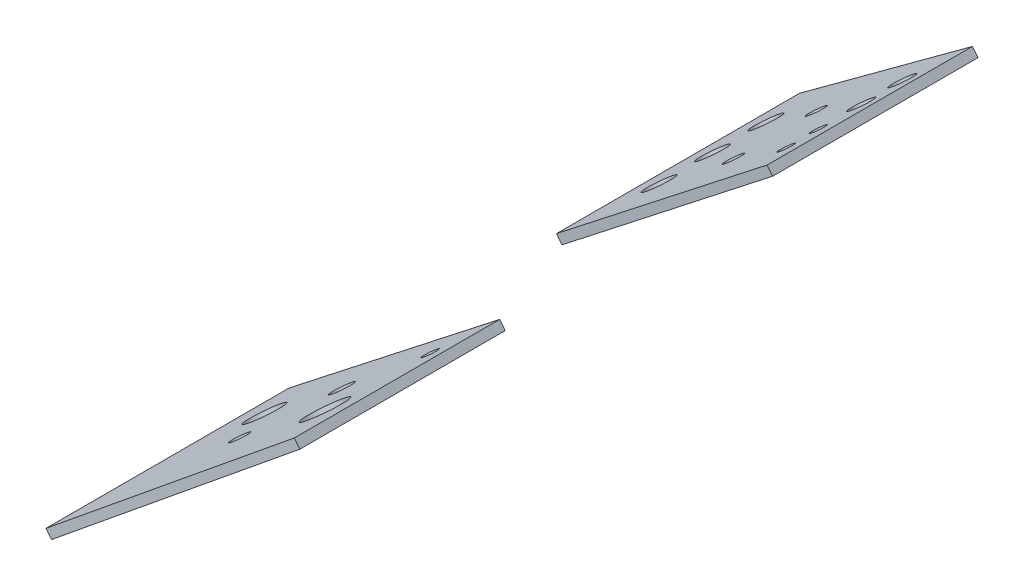
ISO-10303-21;
HEADER;
FILE_DESCRIPTION(('STEP AP214'),'2;1');
FILE_NAME('part.step','',(''),(''),'','','');
FILE_SCHEMA(('AUTOMOTIVE_DESIGN { 1 0 10303 214 1 1 1 1 }'));
ENDSEC;
DATA;
#1=APPLICATION_CONTEXT('core data for automotive mechanical design processes');
#2=APPLICATION_PROTOCOL_DEFINITION('international standard','automotive_design',2000,#1);
#3=PRODUCT_CONTEXT('',#1,'mechanical');
#4=PRODUCT('Part','Part','',(#3));
#5=PRODUCT_RELATED_PRODUCT_CATEGORY('part','',(#4));
#6=PRODUCT_DEFINITION_FORMATION('','',#4);
#7=PRODUCT_DEFINITION_CONTEXT('part definition',#1,'design');
#8=PRODUCT_DEFINITION('design','',#6,#7);
#9=PRODUCT_DEFINITION_SHAPE('','',#8);
#10=(LENGTH_UNIT() NAMED_UNIT(*) SI_UNIT(.MILLI.,.METRE.));
#11=(NAMED_UNIT(*) PLANE_ANGLE_UNIT() SI_UNIT($,.RADIAN.));
#12=(NAMED_UNIT(*) SI_UNIT($,.STERADIAN.) SOLID_ANGLE_UNIT());
#13=UNCERTAINTY_MEASURE_WITH_UNIT(LENGTH_MEASURE(1.E-05),#10,'distance_accuracy_value','');
#14=(GEOMETRIC_REPRESENTATION_CONTEXT(3) GLOBAL_UNCERTAINTY_ASSIGNED_CONTEXT((#13)) GLOBAL_UNIT_ASSIGNED_CONTEXT((#10,
#11,#12)) REPRESENTATION_CONTEXT('',''));
#15=CARTESIAN_POINT('',(0.,0.,0.));
#16=DIRECTION('',(0.,0.,1.));
#17=DIRECTION('',(1.,0.,0.));
#18=AXIS2_PLACEMENT_3D('',#15,#16,#17);
#19=CARTESIAN_POINT('',(649.113479237051,568.315363421584,211.354335392686));
#20=DIRECTION('',(-0.787706201961144,-0.616051085050542,0.));
#21=DIRECTION('',(0.616051085050542,-0.787706201961144,0.));
#22=AXIS2_PLACEMENT_3D('',#19,#20,#21);
#23=PLANE('',#22);
#24=DIRECTION('',(0.,0.,-1.));
#25=VECTOR('',#24,1.);
#26=CARTESIAN_POINT('',(652.193734662304,564.376832411779,211.354335392686));
#27=LINE('',#26,#25);
#28=CARTESIAN_POINT('',(652.193734662304,564.376832411779,-75.));
#29=VERTEX_POINT('',#28);
#30=CARTESIAN_POINT('',(652.193734662304,564.376832411779,-211.354335392686));
#31=VERTEX_POINT('',#30);
#32=EDGE_CURVE('E92',#29,#31,#27,.T.);
#33=ORIENTED_EDGE('',*,*,#32,.F.);
#34=DIRECTION('',(0.616051085050541,-0.787706201961144,0.));
#35=VECTOR('',#34,1.);
#36=CARTESIAN_POINT('',(644.493096099172,574.223159936293,-75.));
#37=LINE('',#36,#35);
#38=CARTESIAN_POINT('',(649.113479237051,568.315363421584,-75.));
#39=VERTEX_POINT('',#38);
#40=EDGE_CURVE('E12',#39,#29,#37,.T.);
#41=ORIENTED_EDGE('',*,*,#40,.F.);
#42=DIRECTION('',(0.,0.,-1.));
#43=VECTOR('',#42,1.);
#44=CARTESIAN_POINT('',(649.113479237051,568.315363421584,211.354335392686));
#45=LINE('',#44,#43);
#46=CARTESIAN_POINT('',(649.113479237051,568.315363421584,-211.354335392686));
#47=VERTEX_POINT('',#46);
#48=EDGE_CURVE('E90',#39,#47,#45,.T.);
#49=ORIENTED_EDGE('',*,*,#48,.T.);
#50=DIRECTION('',(0.616051085050542,-0.787706201961144,0.));
#51=VECTOR('',#50,1.);
#52=CARTESIAN_POINT('',(649.113479237051,568.315363421584,-211.354335392686));
#53=LINE('',#52,#51);
#54=EDGE_CURVE('E97',#47,#31,#53,.T.);
#55=ORIENTED_EDGE('',*,*,#54,.T.);
#56=EDGE_LOOP('',(#33,#41,#49,#55));
#57=FACE_BOUND('',#56,.T.);
#58=ADVANCED_FACE('F44',(#57),#23,.T.);
#59=CARTESIAN_POINT('',(767.269409531223,660.723026179166,-190.231808411609));
#60=DIRECTION('',(0.787706201961144,0.616051085050542,0.));
#61=DIRECTION('',(-0.616051085050542,0.787706201961144,0.));
#62=AXIS2_PLACEMENT_3D('',#59,#60,#61);
#63=PLANE('',#62);
#64=DIRECTION('',(0.,0.,1.));
#65=VECTOR('',#64,1.);
#66=CARTESIAN_POINT('',(767.269409531223,660.723026179166,-190.231808411609));
#67=LINE('',#66,#65);
#68=CARTESIAN_POINT('',(767.269409531223,660.723026179166,-190.231808411609));
#69=VERTEX_POINT('',#68);
#70=CARTESIAN_POINT('',(767.269409531223,660.723026179166,-75.));
#71=VERTEX_POINT('',#70);
#72=EDGE_CURVE('E100',#69,#71,#67,.T.);
#73=ORIENTED_EDGE('',*,*,#72,.T.);
#74=DIRECTION('',(0.616051085050541,-0.787706201961144,0.));
#75=VECTOR('',#74,1.);
#76=CARTESIAN_POINT('',(762.649026393344,666.630822693874,-75.));
#77=LINE('',#76,#75);
#78=CARTESIAN_POINT('',(770.349664956476,656.78449516936,-75.));
#79=VERTEX_POINT('',#78);
#80=EDGE_CURVE('E61',#71,#79,#77,.T.);
#81=ORIENTED_EDGE('',*,*,#80,.T.);
#82=DIRECTION('',(0.,0.,1.));
#83=VECTOR('',#82,1.);
#84=CARTESIAN_POINT('',(770.349664956475,656.78449516936,-190.231808411609));
#85=LINE('',#84,#83);
#86=CARTESIAN_POINT('',(770.349664956475,656.78449516936,-190.231808411609));
#87=VERTEX_POINT('',#86);
#88=EDGE_CURVE('E111',#87,#79,#85,.T.);
#89=ORIENTED_EDGE('',*,*,#88,.F.);
#90=DIRECTION('',(0.616051085050542,-0.787706201961144,0.));
#91=VECTOR('',#90,1.);
#92=CARTESIAN_POINT('',(767.269409531223,660.723026179166,-190.231808411609));
#93=LINE('',#92,#91);
#94=EDGE_CURVE('E85',#69,#87,#93,.T.);
#95=ORIENTED_EDGE('',*,*,#94,.F.);
#96=EDGE_LOOP('',(#73,#81,#89,#95));
#97=FACE_BOUND('',#96,.T.);
#98=ADVANCED_FACE('F166',(#97),#63,.T.);
#99=CARTESIAN_POINT('',(-29.4339802766727,37.6353996851331,0.));
#100=DIRECTION('',(0.616051085050541,-0.787706201961144,0.));
#101=DIRECTION('',(0.787706201961144,0.616051085050541,0.));
#102=AXIS2_PLACEMENT_3D('',#99,#100,#101);
#103=PLANE('',#102);
#104=CARTESIAN_POINT('',(669.713824163367,584.42652874271,-171.938506110887));
#105=DIRECTION('',(-0.616051085050541,0.787706201961144,0.));
#106=DIRECTION('',(-0.787706201961144,-0.616051085050541,0.));
#107=AXIS2_PLACEMENT_3D('',#104,#105,#106);
#108=CIRCLE('',#107,8.00000000000004);
#109=CARTESIAN_POINT('',(663.412174547678,579.498120062306,-171.938506110887));
#110=VERTEX_POINT('',#109);
#111=EDGE_CURVE('E136',#110,#110,#108,.T.);
#112=ORIENTED_EDGE('',*,*,#111,.F.);
#113=EDGE_LOOP('',(#112));
#114=FACE_BOUND('',#113,.T.);
#115=CARTESIAN_POINT('',(669.713824163367,584.426528742711,-141.938506110887));
#116=DIRECTION('',(-0.616051085050541,0.787706201961144,0.));
#117=DIRECTION('',(-0.787706201961144,-0.616051085050541,0.));
#118=AXIS2_PLACEMENT_3D('',#115,#116,#117);
#119=CIRCLE('',#118,7.99999999999998);
#120=CARTESIAN_POINT('',(663.412174547678,579.498120062306,-141.938506110887));
#121=VERTEX_POINT('',#120);
#122=EDGE_CURVE('E200',#121,#121,#119,.T.);
#123=ORIENTED_EDGE('',*,*,#122,.F.);
#124=EDGE_LOOP('',(#123));
#125=FACE_BOUND('',#124,.T.);
#126=CARTESIAN_POINT('',(669.713824163367,584.426528742711,-111.938506110887));
#127=DIRECTION('',(-0.616051085050541,0.787706201961144,0.));
#128=DIRECTION('',(-0.787706201961144,-0.616051085050541,0.));
#129=AXIS2_PLACEMENT_3D('',#126,#127,#128);
#130=CIRCLE('',#129,7.99999999999998);
#131=CARTESIAN_POINT('',(663.412174547678,579.498120062306,-111.938506110887));
#132=VERTEX_POINT('',#131);
#133=EDGE_CURVE('E204',#132,#132,#130,.T.);
#134=ORIENTED_EDGE('',*,*,#133,.F.);
#135=EDGE_LOOP('',(#134));
#136=FACE_BOUND('',#135,.T.);
#137=CARTESIAN_POINT('',(709.84556022636,615.812849537209,-159.901373805683));
#138=DIRECTION('',(-0.616051085050541,0.787706201961144,0.));
#139=DIRECTION('',(-0.787706201961144,-0.616051085050541,0.));
#140=AXIS2_PLACEMENT_3D('',#137,#138,#139);
#141=CIRCLE('',#140,4.99999999999999);
#142=CARTESIAN_POINT('',(705.907029216554,612.732594111957,-159.901373805683));
#143=VERTEX_POINT('',#142);
#144=EDGE_CURVE('E129',#143,#143,#141,.T.);
#145=ORIENTED_EDGE('',*,*,#144,.F.);
#146=EDGE_LOOP('',(#145));
#147=FACE_BOUND('',#146,.T.);
#148=CARTESIAN_POINT('',(709.84556022636,615.812849537209,-113.501373805683));
#149=DIRECTION('',(-0.616051085050541,0.787706201961144,0.));
#150=DIRECTION('',(-0.787706201961144,-0.616051085050541,0.));
#151=AXIS2_PLACEMENT_3D('',#148,#149,#150);
#152=CIRCLE('',#151,4.99999999999999);
#153=CARTESIAN_POINT('',(705.907029216554,612.732594111957,-113.501373805683));
#154=VERTEX_POINT('',#153);
#155=EDGE_CURVE('E141',#154,#154,#152,.T.);
#156=ORIENTED_EDGE('',*,*,#155,.F.);
#157=EDGE_LOOP('',(#156));
#158=FACE_BOUND('',#157,.T.);
#159=CARTESIAN_POINT('',(753.087528243768,649.631627719381,-117.842361568051));
#160=DIRECTION('',(-0.616051085050541,0.787706201961144,0.));
#161=DIRECTION('',(-0.787706201961144,-0.616051085050541,0.));
#162=AXIS2_PLACEMENT_3D('',#159,#160,#161);
#163=CIRCLE('',#162,4.10000000000005);
#164=CARTESIAN_POINT('',(749.857932815727,647.105818270674,-117.842361568051));
#165=VERTEX_POINT('',#164);
#166=EDGE_CURVE('E121',#165,#165,#163,.T.);
#167=ORIENTED_EDGE('',*,*,#166,.F.);
#168=EDGE_LOOP('',(#167));
#169=FACE_BOUND('',#168,.T.);
#170=CARTESIAN_POINT('',(753.087528243768,649.631627719381,-99.8423615680513));
#171=DIRECTION('',(-0.616051085050541,0.787706201961144,0.));
#172=DIRECTION('',(-0.787706201961144,-0.616051085050541,0.));
#173=AXIS2_PLACEMENT_3D('',#170,#171,#172);
#174=CIRCLE('',#173,4.09999999999999);
#175=CARTESIAN_POINT('',(749.857932815727,647.105818270674,-99.8423615680513));
#176=VERTEX_POINT('',#175);
#177=EDGE_CURVE('E132',#176,#176,#174,.T.);
#178=ORIENTED_EDGE('',*,*,#177,.F.);
#179=EDGE_LOOP('',(#178));
#180=FACE_BOUND('',#179,.T.);
#181=CARTESIAN_POINT('',(753.087528243768,649.631627719381,-165.036346105048));
#182=DIRECTION('',(-0.616051085050541,0.787706201961144,0.));
#183=DIRECTION('',(-0.787706201961144,-0.616051085050541,0.));
#184=AXIS2_PLACEMENT_3D('',#181,#182,#183);
#185=CIRCLE('',#184,6.49999999999989);
#186=CARTESIAN_POINT('',(747.96743793102,645.627295666553,-165.036346105048));
#187=VERTEX_POINT('',#186);
#188=EDGE_CURVE('E115',#187,#187,#185,.T.);
#189=ORIENTED_EDGE('',*,*,#188,.F.);
#190=EDGE_LOOP('',(#189));
#191=FACE_BOUND('',#190,.T.);
#192=CARTESIAN_POINT('',(753.087528243768,649.631627719381,-142.036346105048));
#193=DIRECTION('',(-0.616051085050541,0.787706201961144,0.));
#194=DIRECTION('',(-0.787706201961144,-0.616051085050541,0.));
#195=AXIS2_PLACEMENT_3D('',#192,#193,#194);
#196=CIRCLE('',#195,6.49999999999989);
#197=CARTESIAN_POINT('',(747.96743793102,645.627295666553,-142.036346105048));
#198=VERTEX_POINT('',#197);
#199=EDGE_CURVE('E124',#198,#198,#196,.T.);
#200=ORIENTED_EDGE('',*,*,#199,.F.);
#201=EDGE_LOOP('',(#200));
#202=FACE_BOUND('',#201,.T.);
#203=DIRECTION('',(-0.787706201961144,-0.616051085050541,0.));
#204=VECTOR('',#203,1.);
#205=CARTESIAN_POINT('',(-29.4339802766727,37.6353996851331,-74.9999999999999));
#206=LINE('',#205,#204);
#207=EDGE_CURVE('E53',#71,#39,#206,.T.);
#208=ORIENTED_EDGE('',*,*,#207,.F.);
#209=ORIENTED_EDGE('',*,*,#72,.F.);
#210=DIRECTION('',(0.780010599500383,0.610032490510767,0.139441117279962));
#211=VECTOR('',#210,1.);
#212=CARTESIAN_POINT('',(649.113479237051,568.315363421584,-211.354335392686));
#213=LINE('',#212,#211);
#214=EDGE_CURVE('E96',#47,#69,#213,.T.);
#215=ORIENTED_EDGE('',*,*,#214,.F.);
#216=ORIENTED_EDGE('',*,*,#48,.F.);
#217=EDGE_LOOP('',(#208,#209,#215,#216));
#218=FACE_BOUND('',#217,.T.);
#219=ADVANCED_FACE('F94',(#114,#125,#136,#147,#158,#169,#180,#191,#202,#218),#103,.F.);
#220=CARTESIAN_POINT('',(-26.35372485142,33.6968686753274,0.));
#221=DIRECTION('',(0.616051085050541,-0.787706201961144,0.));
#222=DIRECTION('',(0.787706201961144,0.616051085050541,0.));
#223=AXIS2_PLACEMENT_3D('',#220,#221,#222);
#224=PLANE('',#223);
#225=CARTESIAN_POINT('',(672.79407958862,580.487997732905,-171.938506110887));
#226=DIRECTION('',(0.616051085050541,-0.787706201961144,0.));
#227=DIRECTION('',(0.787706201961144,0.616051085050541,0.));
#228=AXIS2_PLACEMENT_3D('',#225,#226,#227);
#229=CIRCLE('',#228,8.00000000000004);
#230=CARTESIAN_POINT('',(679.095729204309,585.416406413309,-171.938506110887));
#231=VERTEX_POINT('',#230);
#232=EDGE_CURVE('E47',#231,#231,#229,.T.);
#233=ORIENTED_EDGE('',*,*,#232,.F.);
#234=EDGE_LOOP('',(#233));
#235=FACE_BOUND('',#234,.T.);
#236=CARTESIAN_POINT('',(672.79407958862,580.487997732905,-141.938506110887));
#237=DIRECTION('',(0.616051085050541,-0.787706201961144,0.));
#238=DIRECTION('',(0.787706201961144,0.616051085050541,0.));
#239=AXIS2_PLACEMENT_3D('',#236,#237,#238);
#240=CIRCLE('',#239,7.99999999999998);
#241=CARTESIAN_POINT('',(679.095729204309,585.416406413309,-141.938506110887));
#242=VERTEX_POINT('',#241);
#243=EDGE_CURVE('E135',#242,#242,#240,.T.);
#244=ORIENTED_EDGE('',*,*,#243,.F.);
#245=EDGE_LOOP('',(#244));
#246=FACE_BOUND('',#245,.T.);
#247=CARTESIAN_POINT('',(672.79407958862,580.487997732905,-111.938506110887));
#248=DIRECTION('',(0.616051085050541,-0.787706201961144,0.));
#249=DIRECTION('',(0.787706201961144,0.616051085050541,0.));
#250=AXIS2_PLACEMENT_3D('',#247,#248,#249);
#251=CIRCLE('',#250,7.99999999999998);
#252=CARTESIAN_POINT('',(679.095729204309,585.416406413309,-111.938506110887));
#253=VERTEX_POINT('',#252);
#254=EDGE_CURVE('E133',#253,#253,#251,.T.);
#255=ORIENTED_EDGE('',*,*,#254,.F.);
#256=EDGE_LOOP('',(#255));
#257=FACE_BOUND('',#256,.T.);
#258=CARTESIAN_POINT('',(712.925815651613,611.874318527404,-159.901373805683));
#259=DIRECTION('',(0.616051085050541,-0.787706201961144,0.));
#260=DIRECTION('',(0.787706201961144,0.616051085050541,0.));
#261=AXIS2_PLACEMENT_3D('',#258,#259,#260);
#262=CIRCLE('',#261,4.99999999999999);
#263=CARTESIAN_POINT('',(716.864346661418,614.954573952656,-159.901373805683));
#264=VERTEX_POINT('',#263);
#265=EDGE_CURVE('E128',#264,#264,#262,.T.);
#266=ORIENTED_EDGE('',*,*,#265,.F.);
#267=EDGE_LOOP('',(#266));
#268=FACE_BOUND('',#267,.T.);
#269=CARTESIAN_POINT('',(712.925815651613,611.874318527404,-113.501373805683));
#270=DIRECTION('',(0.616051085050541,-0.787706201961144,0.));
#271=DIRECTION('',(0.787706201961144,0.616051085050541,0.));
#272=AXIS2_PLACEMENT_3D('',#269,#270,#271);
#273=CIRCLE('',#272,4.99999999999999);
#274=CARTESIAN_POINT('',(716.864346661418,614.954573952656,-113.501373805683));
#275=VERTEX_POINT('',#274);
#276=EDGE_CURVE('E125',#275,#275,#273,.T.);
#277=ORIENTED_EDGE('',*,*,#276,.F.);
#278=EDGE_LOOP('',(#277));
#279=FACE_BOUND('',#278,.T.);
#280=CARTESIAN_POINT('',(756.16778366902,645.693096709575,-117.842361568051));
#281=DIRECTION('',(0.616051085050541,-0.787706201961144,0.));
#282=DIRECTION('',(0.787706201961144,0.616051085050541,0.));
#283=AXIS2_PLACEMENT_3D('',#280,#281,#282);
#284=CIRCLE('',#283,4.10000000000005);
#285=CARTESIAN_POINT('',(759.397379097061,648.218906158283,-117.842361568051));
#286=VERTEX_POINT('',#285);
#287=EDGE_CURVE('E120',#286,#286,#284,.T.);
#288=ORIENTED_EDGE('',*,*,#287,.F.);
#289=EDGE_LOOP('',(#288));
#290=FACE_BOUND('',#289,.T.);
#291=CARTESIAN_POINT('',(756.16778366902,645.693096709575,-99.8423615680513));
#292=DIRECTION('',(0.616051085050541,-0.787706201961144,0.));
#293=DIRECTION('',(0.787706201961144,0.616051085050541,0.));
#294=AXIS2_PLACEMENT_3D('',#291,#292,#293);
#295=CIRCLE('',#294,4.09999999999999);
#296=CARTESIAN_POINT('',(759.397379097061,648.218906158282,-99.8423615680513));
#297=VERTEX_POINT('',#296);
#298=EDGE_CURVE('E117',#297,#297,#295,.T.);
#299=ORIENTED_EDGE('',*,*,#298,.F.);
#300=EDGE_LOOP('',(#299));
#301=FACE_BOUND('',#300,.T.);
#302=CARTESIAN_POINT('',(756.16778366902,645.693096709575,-165.036346105048));
#303=DIRECTION('',(0.616051085050541,-0.787706201961144,0.));
#304=DIRECTION('',(0.787706201961144,0.616051085050541,0.));
#305=AXIS2_PLACEMENT_3D('',#302,#303,#304);
#306=CIRCLE('',#305,6.49999999999989);
#307=CARTESIAN_POINT('',(761.287873981768,649.697428762404,-165.036346105048));
#308=VERTEX_POINT('',#307);
#309=EDGE_CURVE('E98',#308,#308,#306,.T.);
#310=ORIENTED_EDGE('',*,*,#309,.F.);
#311=EDGE_LOOP('',(#310));
#312=FACE_BOUND('',#311,.T.);
#313=CARTESIAN_POINT('',(756.16778366902,645.693096709575,-142.036346105048));
#314=DIRECTION('',(0.616051085050541,-0.787706201961144,0.));
#315=DIRECTION('',(0.787706201961144,0.616051085050541,0.));
#316=AXIS2_PLACEMENT_3D('',#313,#314,#315);
#317=CIRCLE('',#316,6.49999999999989);
#318=CARTESIAN_POINT('',(761.287873981768,649.697428762404,-142.036346105048));
#319=VERTEX_POINT('',#318);
#320=EDGE_CURVE('E103',#319,#319,#317,.T.);
#321=ORIENTED_EDGE('',*,*,#320,.F.);
#322=EDGE_LOOP('',(#321));
#323=FACE_BOUND('',#322,.T.);
#324=ORIENTED_EDGE('',*,*,#88,.T.);
#325=DIRECTION('',(-0.787706201961144,-0.616051085050541,0.));
#326=VECTOR('',#325,1.);
#327=CARTESIAN_POINT('',(-26.35372485142,33.6968686753274,-74.9999999999999));
#328=LINE('',#327,#326);
#329=EDGE_CURVE('E110',#79,#29,#328,.T.);
#330=ORIENTED_EDGE('',*,*,#329,.T.);
#331=ORIENTED_EDGE('',*,*,#32,.T.);
#332=DIRECTION('',(0.780010599500383,0.610032490510767,0.139441117279962));
#333=VECTOR('',#332,1.);
#334=CARTESIAN_POINT('',(652.193734662304,564.376832411779,-211.354335392686));
#335=LINE('',#334,#333);
#336=EDGE_CURVE('E109',#31,#87,#335,.T.);
#337=ORIENTED_EDGE('',*,*,#336,.T.);
#338=EDGE_LOOP('',(#324,#330,#331,#337));
#339=FACE_BOUND('',#338,.T.);
#340=ADVANCED_FACE('F168',(#235,#246,#257,#268,#279,#290,#301,#312,#323,#339),#224,.T.);
#341=CARTESIAN_POINT('',(649.113479237051,568.315363421584,-211.354335392686));
#342=DIRECTION('',(0.109838632889817,0.0859028516009806,-0.990230364517124));
#343=DIRECTION('',(-0.993904313869372,0.,-0.110246155814399));
#344=AXIS2_PLACEMENT_3D('',#341,#342,#343);
#345=PLANE('',#344);
#346=ORIENTED_EDGE('',*,*,#336,.F.);
#347=ORIENTED_EDGE('',*,*,#54,.F.);
#348=ORIENTED_EDGE('',*,*,#214,.T.);
#349=ORIENTED_EDGE('',*,*,#94,.T.);
#350=EDGE_LOOP('',(#346,#347,#348,#349));
#351=FACE_BOUND('',#350,.T.);
#352=ADVANCED_FACE('F171',(#351),#345,.T.);
#353=CARTESIAN_POINT('',(762.649026393344,666.630822693874,-75.));
#354=DIRECTION('',(0.,0.,1.));
#355=DIRECTION('',(1.,0.,0.));
#356=AXIS2_PLACEMENT_3D('',#353,#354,#355);
#357=PLANE('',#356);
#358=ORIENTED_EDGE('',*,*,#207,.T.);
#359=ORIENTED_EDGE('',*,*,#40,.T.);
#360=ORIENTED_EDGE('',*,*,#329,.F.);
#361=ORIENTED_EDGE('',*,*,#80,.F.);
#362=EDGE_LOOP('',(#358,#359,#360,#361));
#363=FACE_BOUND('',#362,.T.);
#364=ADVANCED_FACE('F80',(#363),#357,.T.);
#365=CARTESIAN_POINT('',(759.248039094273,641.75456569977,-142.036346105048));
#366=DIRECTION('',(-0.616051085050541,0.787706201961144,0.));
#367=DIRECTION('',(-0.787706201961144,-0.616051085050541,0.));
#368=AXIS2_PLACEMENT_3D('',#365,#366,#367);
#369=CYLINDRICAL_SURFACE('',#368,6.49999999999989);
#370=ORIENTED_EDGE('',*,*,#320,.T.);
#371=EDGE_LOOP('',(#370));
#372=FACE_BOUND('',#371,.T.);
#373=ORIENTED_EDGE('',*,*,#199,.T.);
#374=EDGE_LOOP('',(#373));
#375=FACE_BOUND('',#374,.T.);
#376=ADVANCED_FACE('F178',(#372,#375),#369,.F.);
#377=CARTESIAN_POINT('',(759.248039094273,641.75456569977,-165.036346105048));
#378=DIRECTION('',(-0.616051085050541,0.787706201961144,0.));
#379=DIRECTION('',(-0.787706201961144,-0.616051085050541,0.));
#380=AXIS2_PLACEMENT_3D('',#377,#378,#379);
#381=CYLINDRICAL_SURFACE('',#380,6.49999999999989);
#382=ORIENTED_EDGE('',*,*,#309,.T.);
#383=EDGE_LOOP('',(#382));
#384=FACE_BOUND('',#383,.T.);
#385=ORIENTED_EDGE('',*,*,#188,.T.);
#386=EDGE_LOOP('',(#385));
#387=FACE_BOUND('',#386,.T.);
#388=ADVANCED_FACE('F217',(#384,#387),#381,.F.);
#389=CARTESIAN_POINT('',(759.248039094273,641.75456569977,-99.8423615680513));
#390=DIRECTION('',(-0.616051085050541,0.787706201961144,0.));
#391=DIRECTION('',(-0.787706201961144,-0.616051085050541,0.));
#392=AXIS2_PLACEMENT_3D('',#389,#390,#391);
#393=CYLINDRICAL_SURFACE('',#392,4.09999999999999);
#394=ORIENTED_EDGE('',*,*,#298,.T.);
#395=EDGE_LOOP('',(#394));
#396=FACE_BOUND('',#395,.T.);
#397=ORIENTED_EDGE('',*,*,#177,.T.);
#398=EDGE_LOOP('',(#397));
#399=FACE_BOUND('',#398,.T.);
#400=ADVANCED_FACE('F222',(#396,#399),#393,.F.);
#401=CARTESIAN_POINT('',(759.248039094273,641.75456569977,-117.842361568051));
#402=DIRECTION('',(-0.616051085050541,0.787706201961144,0.));
#403=DIRECTION('',(-0.787706201961144,-0.616051085050541,0.));
#404=AXIS2_PLACEMENT_3D('',#401,#402,#403);
#405=CYLINDRICAL_SURFACE('',#404,4.10000000000005);
#406=ORIENTED_EDGE('',*,*,#287,.T.);
#407=EDGE_LOOP('',(#406));
#408=FACE_BOUND('',#407,.T.);
#409=ORIENTED_EDGE('',*,*,#166,.T.);
#410=EDGE_LOOP('',(#409));
#411=FACE_BOUND('',#410,.T.);
#412=ADVANCED_FACE('F228',(#408,#411),#405,.F.);
#413=CARTESIAN_POINT('',(716.006071076865,607.935787517598,-113.501373805683));
#414=DIRECTION('',(-0.616051085050541,0.787706201961144,0.));
#415=DIRECTION('',(-0.787706201961144,-0.616051085050541,0.));
#416=AXIS2_PLACEMENT_3D('',#413,#414,#415);
#417=CYLINDRICAL_SURFACE('',#416,4.99999999999999);
#418=ORIENTED_EDGE('',*,*,#276,.T.);
#419=EDGE_LOOP('',(#418));
#420=FACE_BOUND('',#419,.T.);
#421=ORIENTED_EDGE('',*,*,#155,.T.);
#422=EDGE_LOOP('',(#421));
#423=FACE_BOUND('',#422,.T.);
#424=ADVANCED_FACE('F232',(#420,#423),#417,.F.);
#425=CARTESIAN_POINT('',(716.006071076865,607.935787517598,-159.901373805683));
#426=DIRECTION('',(-0.616051085050541,0.787706201961144,0.));
#427=DIRECTION('',(-0.787706201961144,-0.616051085050541,0.));
#428=AXIS2_PLACEMENT_3D('',#425,#426,#427);
#429=CYLINDRICAL_SURFACE('',#428,4.99999999999999);
#430=ORIENTED_EDGE('',*,*,#265,.T.);
#431=EDGE_LOOP('',(#430));
#432=FACE_BOUND('',#431,.T.);
#433=ORIENTED_EDGE('',*,*,#144,.T.);
#434=EDGE_LOOP('',(#433));
#435=FACE_BOUND('',#434,.T.);
#436=ADVANCED_FACE('F236',(#432,#435),#429,.F.);
#437=CARTESIAN_POINT('',(675.874335013872,576.549466723099,-111.938506110887));
#438=DIRECTION('',(-0.616051085050541,0.787706201961144,0.));
#439=DIRECTION('',(-0.787706201961144,-0.616051085050541,0.));
#440=AXIS2_PLACEMENT_3D('',#437,#438,#439);
#441=CYLINDRICAL_SURFACE('',#440,7.99999999999998);
#442=ORIENTED_EDGE('',*,*,#254,.T.);
#443=EDGE_LOOP('',(#442));
#444=FACE_BOUND('',#443,.T.);
#445=ORIENTED_EDGE('',*,*,#133,.T.);
#446=EDGE_LOOP('',(#445));
#447=FACE_BOUND('',#446,.T.);
#448=ADVANCED_FACE('F240',(#444,#447),#441,.F.);
#449=CARTESIAN_POINT('',(675.874335013872,576.549466723099,-141.938506110887));
#450=DIRECTION('',(-0.616051085050541,0.787706201961144,0.));
#451=DIRECTION('',(-0.787706201961144,-0.616051085050541,0.));
#452=AXIS2_PLACEMENT_3D('',#449,#450,#451);
#453=CYLINDRICAL_SURFACE('',#452,7.99999999999998);
#454=ORIENTED_EDGE('',*,*,#243,.T.);
#455=EDGE_LOOP('',(#454));
#456=FACE_BOUND('',#455,.T.);
#457=ORIENTED_EDGE('',*,*,#122,.T.);
#458=EDGE_LOOP('',(#457));
#459=FACE_BOUND('',#458,.T.);
#460=ADVANCED_FACE('F244',(#456,#459),#453,.F.);
#461=CARTESIAN_POINT('',(675.874335013872,576.549466723099,-171.938506110887));
#462=DIRECTION('',(-0.616051085050541,0.787706201961144,0.));
#463=DIRECTION('',(-0.787706201961144,-0.616051085050541,0.));
#464=AXIS2_PLACEMENT_3D('',#461,#462,#463);
#465=CYLINDRICAL_SURFACE('',#464,8.00000000000004);
#466=ORIENTED_EDGE('',*,*,#232,.T.);
#467=EDGE_LOOP('',(#466));
#468=FACE_BOUND('',#467,.T.);
#469=ORIENTED_EDGE('',*,*,#111,.T.);
#470=EDGE_LOOP('',(#469));
#471=FACE_BOUND('',#470,.T.);
#472=ADVANCED_FACE('F248',(#468,#471),#465,.F.);
#473=CLOSED_SHELL('',(#58,#98,#219,#340,#352,#364,#376,#388,#400,#412,#424,#436,#448,#460,#472));
#474=MANIFOLD_SOLID_BREP('B2',#473);
#475=CARTESIAN_POINT('',(767.269409531223,660.723026179166,190.231808411609));
#476=DIRECTION('',(0.109838632889817,0.0859028516009805,0.990230364517124));
#477=DIRECTION('',(0.993904313869372,0.,-0.110246155814399));
#478=AXIS2_PLACEMENT_3D('',#475,#476,#477);
#479=PLANE('',#478);
#480=DIRECTION('',(-0.780010599500383,-0.610032490510767,0.139441117279962));
#481=VECTOR('',#480,1.);
#482=CARTESIAN_POINT('',(770.349664956475,656.78449516936,190.231808411609));
#483=LINE('',#482,#481);
#484=CARTESIAN_POINT('',(770.349664956475,656.78449516936,190.231808411609));
#485=VERTEX_POINT('',#484);
#486=CARTESIAN_POINT('',(652.193734662304,564.376832411779,211.354335392686));
#487=VERTEX_POINT('',#486);
#488=EDGE_CURVE('E394',#485,#487,#483,.T.);
#489=ORIENTED_EDGE('',*,*,#488,.F.);
#490=DIRECTION('',(0.616051085050542,-0.787706201961144,0.));
#491=VECTOR('',#490,1.);
#492=CARTESIAN_POINT('',(767.269409531223,660.723026179166,190.231808411609));
#493=LINE('',#492,#491);
#494=CARTESIAN_POINT('',(767.269409531223,660.723026179166,190.231808411609));
#495=VERTEX_POINT('',#494);
#496=EDGE_CURVE('E398',#495,#485,#493,.T.);
#497=ORIENTED_EDGE('',*,*,#496,.F.);
#498=DIRECTION('',(-0.780010599500383,-0.610032490510767,0.139441117279962));
#499=VECTOR('',#498,1.);
#500=CARTESIAN_POINT('',(767.269409531223,660.723026179166,190.231808411609));
#501=LINE('',#500,#499);
#502=CARTESIAN_POINT('',(649.113479237051,568.315363421584,211.354335392686));
#503=VERTEX_POINT('',#502);
#504=EDGE_CURVE('E396',#495,#503,#501,.T.);
#505=ORIENTED_EDGE('',*,*,#504,.T.);
#506=DIRECTION('',(0.616051085050542,-0.787706201961144,0.));
#507=VECTOR('',#506,1.);
#508=CARTESIAN_POINT('',(649.113479237051,568.315363421584,211.354335392686));
#509=LINE('',#508,#507);
#510=EDGE_CURVE('E365',#503,#487,#509,.T.);
#511=ORIENTED_EDGE('',*,*,#510,.T.);
#512=EDGE_LOOP('',(#489,#497,#505,#511));
#513=FACE_BOUND('',#512,.T.);
#514=ADVANCED_FACE('F356',(#513),#479,.T.);
#515=CARTESIAN_POINT('',(-29.4339802766727,37.6353996851331,0.));
#516=DIRECTION('',(0.616051085050541,-0.787706201961144,0.));
#517=DIRECTION('',(0.787706201961144,0.616051085050541,0.));
#518=AXIS2_PLACEMENT_3D('',#515,#516,#517);
#519=PLANE('',#518);
#520=CARTESIAN_POINT('',(717.56596518659,621.850841673031,113.923539859554));
#521=DIRECTION('',(-0.616051085050541,0.787706201961144,0.));
#522=DIRECTION('',(-0.787706201961144,-0.616051085050541,0.));
#523=AXIS2_PLACEMENT_3D('',#520,#521,#522);
#524=CIRCLE('',#523,5.99999999999996);
#525=CARTESIAN_POINT('',(712.839727974823,618.154535162728,113.923539859554));
#526=VERTEX_POINT('',#525);
#527=EDGE_CURVE('E442',#526,#526,#524,.T.);
#528=ORIENTED_EDGE('',*,*,#527,.F.);
#529=EDGE_LOOP('',(#528));
#530=FACE_BOUND('',#529,.T.);
#531=CARTESIAN_POINT('',(674.242124078727,587.968031995251,113.923539859554));
#532=DIRECTION('',(-0.616051085050541,0.787706201961144,0.));
#533=DIRECTION('',(-0.787706201961144,-0.616051085050541,0.));
#534=AXIS2_PLACEMENT_3D('',#531,#532,#533);
#535=CIRCLE('',#534,10.);
#536=CARTESIAN_POINT('',(666.365062059116,581.807521144746,113.923539859554));
#537=VERTEX_POINT('',#536);
#538=EDGE_CURVE('E431',#537,#537,#535,.T.);
#539=ORIENTED_EDGE('',*,*,#538,.F.);
#540=EDGE_LOOP('',(#539));
#541=FACE_BOUND('',#540,.T.);
#542=CARTESIAN_POINT('',(753.087528243768,649.631627719381,99.8423615680513));
#543=DIRECTION('',(-0.616051085050541,0.787706201961144,0.));
#544=DIRECTION('',(-0.787706201961144,-0.616051085050541,0.));
#545=AXIS2_PLACEMENT_3D('',#542,#543,#544);
#546=CIRCLE('',#545,4.10000000000022);
#547=CARTESIAN_POINT('',(749.857932815727,647.105818270674,99.8423615680513));
#548=VERTEX_POINT('',#547);
#549=EDGE_CURVE('E423',#548,#548,#546,.T.);
#550=ORIENTED_EDGE('',*,*,#549,.F.);
#551=EDGE_LOOP('',(#550));
#552=FACE_BOUND('',#551,.T.);
#553=CARTESIAN_POINT('',(743.351691504804,642.017402044909,149.148862314285));
#554=DIRECTION('',(-0.616051085050541,0.787706201961144,0.));
#555=DIRECTION('',(-0.787706201961144,-0.616051085050541,0.));
#556=AXIS2_PLACEMENT_3D('',#553,#554,#555);
#557=CIRCLE('',#556,11.5);
#558=CARTESIAN_POINT('',(734.293070182251,634.932814566827,149.148862314285));
#559=VERTEX_POINT('',#558);
#560=EDGE_CURVE('E435',#559,#559,#557,.T.);
#561=ORIENTED_EDGE('',*,*,#560,.F.);
#562=EDGE_LOOP('',(#561));
#563=FACE_BOUND('',#562,.T.);
#564=CARTESIAN_POINT('',(695.514975676876,604.605152886938,149.148862314285));
#565=DIRECTION('',(-0.616051085050541,0.787706201961144,0.));
#566=DIRECTION('',(-0.787706201961144,-0.616051085050541,0.));
#567=AXIS2_PLACEMENT_3D('',#564,#565,#566);
#568=CIRCLE('',#567,4.99999999999999);
#569=CARTESIAN_POINT('',(691.576444667071,601.524897461685,149.148862314285));
#570=VERTEX_POINT('',#569);
#571=EDGE_CURVE('E430',#570,#570,#568,.T.);
#572=ORIENTED_EDGE('',*,*,#571,.F.);
#573=EDGE_LOOP('',(#572));
#574=FACE_BOUND('',#573,.T.);
#575=DIRECTION('',(0.787706201961144,0.616051085050541,0.));
#576=VECTOR('',#575,1.);
#577=CARTESIAN_POINT('',(-29.4339802766727,37.6353996851331,75.0000000000001));
#578=LINE('',#577,#576);
#579=CARTESIAN_POINT('',(649.113479237051,568.315363421584,75.));
#580=VERTEX_POINT('',#579);
#581=CARTESIAN_POINT('',(767.269409531223,660.723026179166,75.));
#582=VERTEX_POINT('',#581);
#583=EDGE_CURVE('E451',#580,#582,#578,.T.);
#584=ORIENTED_EDGE('',*,*,#583,.F.);
#585=DIRECTION('',(0.,0.,-1.));
#586=VECTOR('',#585,1.);
#587=CARTESIAN_POINT('',(649.113479237051,568.315363421584,211.354335392686));
#588=LINE('',#587,#586);
#589=EDGE_CURVE('E417',#503,#580,#588,.T.);
#590=ORIENTED_EDGE('',*,*,#589,.F.);
#591=ORIENTED_EDGE('',*,*,#504,.F.);
#592=DIRECTION('',(0.,0.,1.));
#593=VECTOR('',#592,1.);
#594=CARTESIAN_POINT('',(767.269409531223,660.723026179166,-190.231808411609));
#595=LINE('',#594,#593);
#596=EDGE_CURVE('E412',#582,#495,#595,.T.);
#597=ORIENTED_EDGE('',*,*,#596,.F.);
#598=EDGE_LOOP('',(#584,#590,#591,#597));
#599=FACE_BOUND('',#598,.T.);
#600=ADVANCED_FACE('F459',(#530,#541,#552,#563,#574,#599),#519,.F.);
#601=CARTESIAN_POINT('',(-26.35372485142,33.6968686753274,0.));
#602=DIRECTION('',(0.616051085050541,-0.787706201961144,0.));
#603=DIRECTION('',(0.787706201961144,0.616051085050541,0.));
#604=AXIS2_PLACEMENT_3D('',#601,#602,#603);
#605=PLANE('',#604);
#606=CARTESIAN_POINT('',(720.646220611843,617.912310663226,113.923539859554));
#607=DIRECTION('',(0.616051085050541,-0.787706201961144,0.));
#608=DIRECTION('',(0.787706201961144,0.616051085050541,0.));
#609=AXIS2_PLACEMENT_3D('',#606,#607,#608);
#610=CIRCLE('',#609,5.99999999999996);
#611=CARTESIAN_POINT('',(725.37245782361,621.608617173529,113.923539859554));
#612=VERTEX_POINT('',#611);
#613=EDGE_CURVE('E360',#612,#612,#610,.T.);
#614=ORIENTED_EDGE('',*,*,#613,.F.);
#615=EDGE_LOOP('',(#614));
#616=FACE_BOUND('',#615,.T.);
#617=CARTESIAN_POINT('',(677.32237950398,584.029500985445,113.923539859554));
#618=DIRECTION('',(0.616051085050541,-0.787706201961144,0.));
#619=DIRECTION('',(0.787706201961144,0.616051085050541,0.));
#620=AXIS2_PLACEMENT_3D('',#617,#618,#619);
#621=CIRCLE('',#620,10.);
#622=CARTESIAN_POINT('',(685.199441523591,590.190011835951,113.923539859554));
#623=VERTEX_POINT('',#622);
#624=EDGE_CURVE('E428',#623,#623,#621,.T.);
#625=ORIENTED_EDGE('',*,*,#624,.F.);
#626=EDGE_LOOP('',(#625));
#627=FACE_BOUND('',#626,.T.);
#628=CARTESIAN_POINT('',(756.167783669021,645.693096709575,99.8423615680513));
#629=DIRECTION('',(0.616051085050541,-0.787706201961144,0.));
#630=DIRECTION('',(0.787706201961144,0.616051085050541,0.));
#631=AXIS2_PLACEMENT_3D('',#628,#629,#630);
#632=CIRCLE('',#631,4.10000000000022);
#633=CARTESIAN_POINT('',(759.397379097062,648.218906158283,99.8423615680513));
#634=VERTEX_POINT('',#633);
#635=EDGE_CURVE('E426',#634,#634,#632,.T.);
#636=ORIENTED_EDGE('',*,*,#635,.F.);
#637=EDGE_LOOP('',(#636));
#638=FACE_BOUND('',#637,.T.);
#639=CARTESIAN_POINT('',(746.431946930056,638.078871035103,149.148862314285));
#640=DIRECTION('',(0.616051085050541,-0.787706201961144,0.));
#641=DIRECTION('',(0.787706201961144,0.616051085050541,0.));
#642=AXIS2_PLACEMENT_3D('',#639,#640,#641);
#643=CIRCLE('',#642,11.5);
#644=CARTESIAN_POINT('',(755.490568252609,645.163458513184,149.148862314285));
#645=VERTEX_POINT('',#644);
#646=EDGE_CURVE('E422',#645,#645,#643,.T.);
#647=ORIENTED_EDGE('',*,*,#646,.F.);
#648=EDGE_LOOP('',(#647));
#649=FACE_BOUND('',#648,.T.);
#650=CARTESIAN_POINT('',(698.595231102129,600.666621877132,149.148862314285));
#651=DIRECTION('',(0.616051085050541,-0.787706201961144,0.));
#652=DIRECTION('',(0.787706201961144,0.616051085050541,0.));
#653=AXIS2_PLACEMENT_3D('',#650,#651,#652);
#654=CIRCLE('',#653,4.99999999999999);
#655=CARTESIAN_POINT('',(702.533762111935,603.746877302385,149.148862314285));
#656=VERTEX_POINT('',#655);
#657=EDGE_CURVE('E419',#656,#656,#654,.T.);
#658=ORIENTED_EDGE('',*,*,#657,.F.);
#659=EDGE_LOOP('',(#658));
#660=FACE_BOUND('',#659,.T.);
#661=DIRECTION('',(0.,0.,-1.));
#662=VECTOR('',#661,1.);
#663=CARTESIAN_POINT('',(652.193734662304,564.376832411779,211.354335392686));
#664=LINE('',#663,#662);
#665=CARTESIAN_POINT('',(652.193734662304,564.376832411779,75.));
#666=VERTEX_POINT('',#665);
#667=EDGE_CURVE('E403',#487,#666,#664,.T.);
#668=ORIENTED_EDGE('',*,*,#667,.T.);
#669=DIRECTION('',(0.787706201961144,0.616051085050541,0.));
#670=VECTOR('',#669,1.);
#671=CARTESIAN_POINT('',(-26.35372485142,33.6968686753274,75.0000000000001));
#672=LINE('',#671,#670);
#673=CARTESIAN_POINT('',(770.349664956475,656.78449516936,74.9999999999999));
#674=VERTEX_POINT('',#673);
#675=EDGE_CURVE('E42',#666,#674,#672,.T.);
#676=ORIENTED_EDGE('',*,*,#675,.T.);
#677=DIRECTION('',(0.,0.,1.));
#678=VECTOR('',#677,1.);
#679=CARTESIAN_POINT('',(770.349664956475,656.78449516936,-190.231808411609));
#680=LINE('',#679,#678);
#681=EDGE_CURVE('E405',#674,#485,#680,.T.);
#682=ORIENTED_EDGE('',*,*,#681,.T.);
#683=ORIENTED_EDGE('',*,*,#488,.T.);
#684=EDGE_LOOP('',(#668,#676,#682,#683));
#685=FACE_BOUND('',#684,.T.);
#686=ADVANCED_FACE('F402',(#616,#627,#638,#649,#660,#685),#605,.T.);
#687=CARTESIAN_POINT('',(767.269409531223,660.723026179166,-190.231808411609));
#688=DIRECTION('',(0.787706201961144,0.616051085050542,0.));
#689=DIRECTION('',(-0.616051085050542,0.787706201961144,0.));
#690=AXIS2_PLACEMENT_3D('',#687,#688,#689);
#691=PLANE('',#690);
#692=ORIENTED_EDGE('',*,*,#681,.F.);
#693=DIRECTION('',(0.616051085050541,-0.787706201961144,0.));
#694=VECTOR('',#693,1.);
#695=CARTESIAN_POINT('',(762.649026393344,666.630822693874,75.));
#696=LINE('',#695,#694);
#697=EDGE_CURVE('E373',#582,#674,#696,.T.);
#698=ORIENTED_EDGE('',*,*,#697,.F.);
#699=ORIENTED_EDGE('',*,*,#596,.T.);
#700=ORIENTED_EDGE('',*,*,#496,.T.);
#701=EDGE_LOOP('',(#692,#698,#699,#700));
#702=FACE_BOUND('',#701,.T.);
#703=ADVANCED_FACE('F358',(#702),#691,.T.);
#704=CARTESIAN_POINT('',(649.113479237051,568.315363421584,211.354335392686));
#705=DIRECTION('',(-0.787706201961144,-0.616051085050542,0.));
#706=DIRECTION('',(0.616051085050542,-0.787706201961144,0.));
#707=AXIS2_PLACEMENT_3D('',#704,#705,#706);
#708=PLANE('',#707);
#709=ORIENTED_EDGE('',*,*,#589,.T.);
#710=DIRECTION('',(0.616051085050541,-0.787706201961144,0.));
#711=VECTOR('',#710,1.);
#712=CARTESIAN_POINT('',(644.493096099172,574.223159936293,75.));
#713=LINE('',#712,#711);
#714=EDGE_CURVE('E411',#580,#666,#713,.T.);
#715=ORIENTED_EDGE('',*,*,#714,.T.);
#716=ORIENTED_EDGE('',*,*,#667,.F.);
#717=ORIENTED_EDGE('',*,*,#510,.F.);
#718=EDGE_LOOP('',(#709,#715,#716,#717));
#719=FACE_BOUND('',#718,.T.);
#720=ADVANCED_FACE('F409',(#719),#708,.T.);
#721=CARTESIAN_POINT('',(762.649026393344,666.630822693874,75.));
#722=DIRECTION('',(0.,0.,-1.));
#723=DIRECTION('',(-1.,0.,0.));
#724=AXIS2_PLACEMENT_3D('',#721,#722,#723);
#725=PLANE('',#724);
#726=ORIENTED_EDGE('',*,*,#583,.T.);
#727=ORIENTED_EDGE('',*,*,#697,.T.);
#728=ORIENTED_EDGE('',*,*,#675,.F.);
#729=ORIENTED_EDGE('',*,*,#714,.F.);
#730=EDGE_LOOP('',(#726,#727,#728,#729));
#731=FACE_BOUND('',#730,.T.);
#732=ADVANCED_FACE('F461',(#731),#725,.T.);
#733=CARTESIAN_POINT('',(701.675486527382,596.728090867327,149.148862314285));
#734=DIRECTION('',(-0.616051085050541,0.787706201961144,0.));
#735=DIRECTION('',(-0.787706201961144,-0.616051085050541,0.));
#736=AXIS2_PLACEMENT_3D('',#733,#734,#735);
#737=CYLINDRICAL_SURFACE('',#736,4.99999999999999);
#738=ORIENTED_EDGE('',*,*,#657,.T.);
#739=EDGE_LOOP('',(#738));
#740=FACE_BOUND('',#739,.T.);
#741=ORIENTED_EDGE('',*,*,#571,.T.);
#742=EDGE_LOOP('',(#741));
#743=FACE_BOUND('',#742,.T.);
#744=ADVANCED_FACE('F481',(#740,#743),#737,.F.);
#745=CARTESIAN_POINT('',(749.512202355309,634.140340025297,149.148862314285));
#746=DIRECTION('',(-0.616051085050541,0.787706201961144,0.));
#747=DIRECTION('',(-0.787706201961144,-0.616051085050541,0.));
#748=AXIS2_PLACEMENT_3D('',#745,#746,#747);
#749=CYLINDRICAL_SURFACE('',#748,11.5);
#750=ORIENTED_EDGE('',*,*,#646,.T.);
#751=EDGE_LOOP('',(#750));
#752=FACE_BOUND('',#751,.T.);
#753=ORIENTED_EDGE('',*,*,#560,.T.);
#754=EDGE_LOOP('',(#753));
#755=FACE_BOUND('',#754,.T.);
#756=ADVANCED_FACE('F484',(#752,#755),#749,.F.);
#757=CARTESIAN_POINT('',(759.248039094273,641.75456569977,99.8423615680513));
#758=DIRECTION('',(-0.616051085050541,0.787706201961144,0.));
#759=DIRECTION('',(-0.787706201961144,-0.616051085050541,0.));
#760=AXIS2_PLACEMENT_3D('',#757,#758,#759);
#761=CYLINDRICAL_SURFACE('',#760,4.10000000000022);
#762=ORIENTED_EDGE('',*,*,#635,.T.);
#763=EDGE_LOOP('',(#762));
#764=FACE_BOUND('',#763,.T.);
#765=ORIENTED_EDGE('',*,*,#549,.T.);
#766=EDGE_LOOP('',(#765));
#767=FACE_BOUND('',#766,.T.);
#768=ADVANCED_FACE('F488',(#764,#767),#761,.F.);
#769=CARTESIAN_POINT('',(680.402634929232,580.09096997564,113.923539859554));
#770=DIRECTION('',(-0.616051085050541,0.787706201961144,0.));
#771=DIRECTION('',(-0.787706201961144,-0.616051085050541,0.));
#772=AXIS2_PLACEMENT_3D('',#769,#770,#771);
#773=CYLINDRICAL_SURFACE('',#772,10.);
#774=ORIENTED_EDGE('',*,*,#624,.T.);
#775=EDGE_LOOP('',(#774));
#776=FACE_BOUND('',#775,.T.);
#777=ORIENTED_EDGE('',*,*,#538,.T.);
#778=EDGE_LOOP('',(#777));
#779=FACE_BOUND('',#778,.T.);
#780=ADVANCED_FACE('F492',(#776,#779),#773,.F.);
#781=CARTESIAN_POINT('',(723.726476037096,613.97377965342,113.923539859554));
#782=DIRECTION('',(-0.616051085050541,0.787706201961144,0.));
#783=DIRECTION('',(-0.787706201961144,-0.616051085050541,0.));
#784=AXIS2_PLACEMENT_3D('',#781,#782,#783);
#785=CYLINDRICAL_SURFACE('',#784,5.99999999999996);
#786=ORIENTED_EDGE('',*,*,#613,.T.);
#787=EDGE_LOOP('',(#786));
#788=FACE_BOUND('',#787,.T.);
#789=ORIENTED_EDGE('',*,*,#527,.T.);
#790=EDGE_LOOP('',(#789));
#791=FACE_BOUND('',#790,.T.);
#792=ADVANCED_FACE('F496',(#788,#791),#785,.F.);
#793=CLOSED_SHELL('',(#514,#600,#686,#703,#720,#732,#744,#756,#768,#780,#792));
#794=MANIFOLD_SOLID_BREP('B6',#793);
#795=ADVANCED_BREP_SHAPE_REPRESENTATION('',(#18,#474,#794),#14);
#796=SHAPE_DEFINITION_REPRESENTATION(#9,#795);
ENDSEC;
END-ISO-10303-21;
